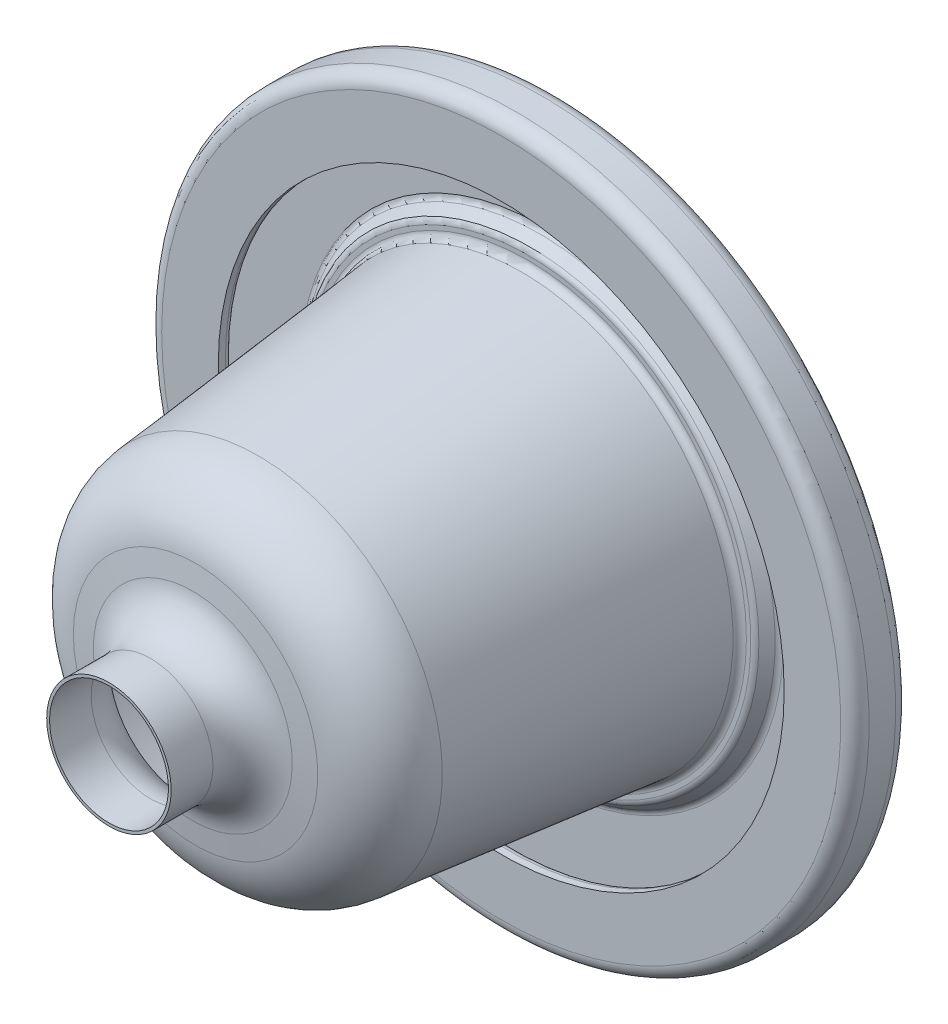
ISO-10303-21;
HEADER;
FILE_DESCRIPTION(('STEP AP214'),'2;1');
FILE_NAME('part.step','',(''),(''),'','','');
FILE_SCHEMA(('AUTOMOTIVE_DESIGN { 1 0 10303 214 1 1 1 1 }'));
ENDSEC;
DATA;
#1=APPLICATION_CONTEXT('core data for automotive mechanical design processes');
#2=APPLICATION_PROTOCOL_DEFINITION('international standard','automotive_design',2000,#1);
#3=PRODUCT_CONTEXT('',#1,'mechanical');
#4=PRODUCT('Part','Part','',(#3));
#5=PRODUCT_RELATED_PRODUCT_CATEGORY('part','',(#4));
#6=PRODUCT_DEFINITION_FORMATION('','',#4);
#7=PRODUCT_DEFINITION_CONTEXT('part definition',#1,'design');
#8=PRODUCT_DEFINITION('design','',#6,#7);
#9=PRODUCT_DEFINITION_SHAPE('','',#8);
#10=(LENGTH_UNIT() NAMED_UNIT(*) SI_UNIT(.MILLI.,.METRE.));
#11=(NAMED_UNIT(*) PLANE_ANGLE_UNIT() SI_UNIT($,.RADIAN.));
#12=(NAMED_UNIT(*) SI_UNIT($,.STERADIAN.) SOLID_ANGLE_UNIT());
#13=UNCERTAINTY_MEASURE_WITH_UNIT(LENGTH_MEASURE(1.E-05),#10,'distance_accuracy_value','');
#14=(GEOMETRIC_REPRESENTATION_CONTEXT(3) GLOBAL_UNCERTAINTY_ASSIGNED_CONTEXT((#13)) GLOBAL_UNIT_ASSIGNED_CONTEXT((#10,
#11,#12)) REPRESENTATION_CONTEXT('',''));
#15=CARTESIAN_POINT('',(0.,0.,0.));
#16=DIRECTION('',(0.,0.,1.));
#17=DIRECTION('',(1.,0.,0.));
#18=AXIS2_PLACEMENT_3D('',#15,#16,#17);
#19=CARTESIAN_POINT('',(0.,0.,-2.60568683672719));
#20=DIRECTION('',(0.,0.,1.));
#21=DIRECTION('',(1.,0.,0.));
#22=AXIS2_PLACEMENT_3D('',#19,#20,#21);
#23=PLANE('',#22);
#24=CARTESIAN_POINT('',(0.,0.,-2.60568683672719));
#25=DIRECTION('',(0.,0.,-1.));
#26=DIRECTION('',(-1.,0.,0.));
#27=AXIS2_PLACEMENT_3D('',#24,#25,#26);
#28=CIRCLE('',#27,15.8);
#29=CARTESIAN_POINT('',(-15.8,0.,-2.60568683672719));
#30=VERTEX_POINT('',#29);
#31=EDGE_CURVE('E253',#30,#30,#28,.T.);
#32=ORIENTED_EDGE('',*,*,#31,.T.);
#33=EDGE_LOOP('',(#32));
#34=FACE_BOUND('',#33,.T.);
#35=ADVANCED_FACE('F39',(#34),#23,.F.);
#36=CARTESIAN_POINT('',(0.2,0.,-2.40568683672719));
#37=DIRECTION('',(0.,0.,-1.));
#38=DIRECTION('',(-1.,0.,0.));
#39=AXIS2_PLACEMENT_3D('',#36,#37,#38);
#40=PLANE('',#39);
#41=CARTESIAN_POINT('',(0.,0.,-2.40568683672719));
#42=DIRECTION('',(0.,0.,-1.));
#43=DIRECTION('',(-1.,0.,0.));
#44=AXIS2_PLACEMENT_3D('',#41,#42,#43);
#45=CIRCLE('',#44,15.6);
#46=CARTESIAN_POINT('',(-15.6,0.,-2.40568683672719));
#47=VERTEX_POINT('',#46);
#48=EDGE_CURVE('E10',#47,#47,#45,.T.);
#49=ORIENTED_EDGE('',*,*,#48,.F.);
#50=EDGE_LOOP('',(#49));
#51=FACE_BOUND('',#50,.T.);
#52=ADVANCED_FACE('F560',(#51),#40,.F.);
#53=CARTESIAN_POINT('',(0.,0.,-2.20568683672719));
#54=DIRECTION('',(0.,0.,-1.));
#55=DIRECTION('',(-1.,0.,0.));
#56=AXIS2_PLACEMENT_3D('',#53,#54,#55);
#57=TOROIDAL_SURFACE('',#56,15.6,0.2);
#58=CARTESIAN_POINT('',(0.,0.,-2.20568683672719));
#59=DIRECTION('',(0.,0.,-1.));
#60=DIRECTION('',(-1.,0.,0.));
#61=AXIS2_PLACEMENT_3D('',#58,#59,#60);
#62=CIRCLE('',#61,15.8);
#63=CARTESIAN_POINT('',(-15.8,0.,-2.20568683672719));
#64=VERTEX_POINT('',#63);
#65=EDGE_CURVE('E46',#64,#64,#62,.T.);
#66=ORIENTED_EDGE('',*,*,#65,.F.);
#67=EDGE_LOOP('',(#66));
#68=FACE_BOUND('',#67,.T.);
#69=ORIENTED_EDGE('',*,*,#48,.T.);
#70=EDGE_LOOP('',(#69));
#71=FACE_BOUND('',#70,.T.);
#72=ADVANCED_FACE('F555',(#68,#71),#57,.F.);
#73=CARTESIAN_POINT('',(0.,0.,0.));
#74=DIRECTION('',(0.,0.,-1.));
#75=DIRECTION('',(-1.,0.,0.));
#76=AXIS2_PLACEMENT_3D('',#73,#74,#75);
#77=CYLINDRICAL_SURFACE('',#76,15.8);
#78=CARTESIAN_POINT('',(0.,0.,-1.60568683672719));
#79=DIRECTION('',(0.,0.,-1.));
#80=DIRECTION('',(-1.,0.,0.));
#81=AXIS2_PLACEMENT_3D('',#78,#79,#80);
#82=CIRCLE('',#81,15.8);
#83=CARTESIAN_POINT('',(-15.8,0.,-1.60568683672719));
#84=VERTEX_POINT('',#83);
#85=EDGE_CURVE('E53',#84,#84,#82,.T.);
#86=ORIENTED_EDGE('',*,*,#85,.F.);
#87=EDGE_LOOP('',(#86));
#88=FACE_BOUND('',#87,.T.);
#89=ORIENTED_EDGE('',*,*,#65,.T.);
#90=EDGE_LOOP('',(#89));
#91=FACE_BOUND('',#90,.T.);
#92=ADVANCED_FACE('F550',(#88,#91),#77,.F.);
#93=CARTESIAN_POINT('',(0.,0.,-1.60568683672719));
#94=DIRECTION('',(0.,0.,-1.));
#95=DIRECTION('',(-1.,0.,0.));
#96=AXIS2_PLACEMENT_3D('',#93,#94,#95);
#97=TOROIDAL_SURFACE('',#96,16.,0.199999999999999);
#98=CARTESIAN_POINT('',(0.,0.,-1.40568683672719));
#99=DIRECTION('',(0.,0.,-1.));
#100=DIRECTION('',(-1.,0.,0.));
#101=AXIS2_PLACEMENT_3D('',#98,#99,#100);
#102=CIRCLE('',#101,16.);
#103=CARTESIAN_POINT('',(-16.,0.,-1.40568683672719));
#104=VERTEX_POINT('',#103);
#105=EDGE_CURVE('E59',#104,#104,#102,.T.);
#106=ORIENTED_EDGE('',*,*,#105,.F.);
#107=EDGE_LOOP('',(#106));
#108=FACE_BOUND('',#107,.T.);
#109=ORIENTED_EDGE('',*,*,#85,.T.);
#110=EDGE_LOOP('',(#109));
#111=FACE_BOUND('',#110,.T.);
#112=ADVANCED_FACE('F544',(#108,#111),#97,.T.);
#113=CARTESIAN_POINT('',(16.,0.,-1.40568683672719));
#114=DIRECTION('',(0.,0.,-1.));
#115=DIRECTION('',(-1.,0.,0.));
#116=AXIS2_PLACEMENT_3D('',#113,#114,#115);
#117=PLANE('',#116);
#118=CARTESIAN_POINT('',(0.,0.,-1.40568683672719));
#119=DIRECTION('',(0.,0.,-1.));
#120=DIRECTION('',(-1.,0.,0.));
#121=AXIS2_PLACEMENT_3D('',#118,#119,#120);
#122=CIRCLE('',#121,23.8);
#123=CARTESIAN_POINT('',(-23.8,0.,-1.40568683672719));
#124=VERTEX_POINT('',#123);
#125=EDGE_CURVE('E65',#124,#124,#122,.T.);
#126=ORIENTED_EDGE('',*,*,#125,.F.);
#127=EDGE_LOOP('',(#126));
#128=FACE_BOUND('',#127,.T.);
#129=ORIENTED_EDGE('',*,*,#105,.T.);
#130=EDGE_LOOP('',(#129));
#131=FACE_BOUND('',#130,.T.);
#132=ADVANCED_FACE('F538',(#128,#131),#117,.F.);
#133=CARTESIAN_POINT('',(0.,0.,-0.405686836727189));
#134=DIRECTION('',(0.,0.,-1.));
#135=DIRECTION('',(-1.,0.,0.));
#136=AXIS2_PLACEMENT_3D('',#133,#134,#135);
#137=TOROIDAL_SURFACE('',#136,23.8,1.);
#138=CARTESIAN_POINT('',(0.,0.,-0.405686836727182));
#139=DIRECTION('',(0.,0.,-1.));
#140=DIRECTION('',(-1.,0.,0.));
#141=AXIS2_PLACEMENT_3D('',#138,#139,#140);
#142=CIRCLE('',#141,24.8);
#143=CARTESIAN_POINT('',(-24.8,0.,-0.405686836727182));
#144=VERTEX_POINT('',#143);
#145=EDGE_CURVE('E69',#144,#144,#142,.T.);
#146=ORIENTED_EDGE('',*,*,#145,.F.);
#147=EDGE_LOOP('',(#146));
#148=FACE_BOUND('',#147,.T.);
#149=ORIENTED_EDGE('',*,*,#125,.T.);
#150=EDGE_LOOP('',(#149));
#151=FACE_BOUND('',#150,.T.);
#152=ADVANCED_FACE('F532',(#148,#151),#137,.F.);
#153=CARTESIAN_POINT('',(0.,0.,0.));
#154=DIRECTION('',(0.,0.,-1.));
#155=DIRECTION('',(-1.,0.,0.));
#156=AXIS2_PLACEMENT_3D('',#153,#154,#155);
#157=CYLINDRICAL_SURFACE('',#156,24.8);
#158=CARTESIAN_POINT('',(0.,0.,1.07323664059718));
#159=DIRECTION('',(0.,0.,-1.));
#160=DIRECTION('',(-1.,0.,0.));
#161=AXIS2_PLACEMENT_3D('',#158,#159,#160);
#162=CIRCLE('',#161,24.8);
#163=CARTESIAN_POINT('',(-24.8,0.,1.07323664059718));
#164=VERTEX_POINT('',#163);
#165=EDGE_CURVE('E73',#164,#164,#162,.T.);
#166=ORIENTED_EDGE('',*,*,#165,.F.);
#167=EDGE_LOOP('',(#166));
#168=FACE_BOUND('',#167,.T.);
#169=ORIENTED_EDGE('',*,*,#145,.T.);
#170=EDGE_LOOP('',(#169));
#171=FACE_BOUND('',#170,.T.);
#172=ADVANCED_FACE('F526',(#168,#171),#157,.F.);
#173=CARTESIAN_POINT('',(0.,0.,1.07323664059719));
#174=DIRECTION('',(0.,0.,-1.));
#175=DIRECTION('',(-1.,0.,0.));
#176=AXIS2_PLACEMENT_3D('',#173,#174,#175);
#177=TOROIDAL_SURFACE('',#176,23.8,1.);
#178=CARTESIAN_POINT('',(0.,0.,2.07323664059719));
#179=DIRECTION('',(0.,0.,-1.));
#180=DIRECTION('',(-1.,0.,0.));
#181=AXIS2_PLACEMENT_3D('',#178,#179,#180);
#182=CIRCLE('',#181,23.8);
#183=CARTESIAN_POINT('',(-23.8,0.,2.07323664059719));
#184=VERTEX_POINT('',#183);
#185=EDGE_CURVE('E77',#184,#184,#182,.T.);
#186=ORIENTED_EDGE('',*,*,#185,.F.);
#187=EDGE_LOOP('',(#186));
#188=FACE_BOUND('',#187,.T.);
#189=ORIENTED_EDGE('',*,*,#165,.T.);
#190=EDGE_LOOP('',(#189));
#191=FACE_BOUND('',#190,.T.);
#192=ADVANCED_FACE('F520',(#188,#191),#177,.F.);
#193=CARTESIAN_POINT('',(23.8,0.,2.07323664059719));
#194=DIRECTION('',(0.,0.,1.));
#195=DIRECTION('',(1.,0.,0.));
#196=AXIS2_PLACEMENT_3D('',#193,#194,#195);
#197=PLANE('',#196);
#198=CARTESIAN_POINT('',(0.,0.,2.07323664059719));
#199=DIRECTION('',(0.,0.,-1.));
#200=DIRECTION('',(-1.,0.,0.));
#201=AXIS2_PLACEMENT_3D('',#198,#199,#200);
#202=CIRCLE('',#201,20.2);
#203=CARTESIAN_POINT('',(-20.2,0.,2.07323664059719));
#204=VERTEX_POINT('',#203);
#205=EDGE_CURVE('E81',#204,#204,#202,.T.);
#206=ORIENTED_EDGE('',*,*,#205,.F.);
#207=EDGE_LOOP('',(#206));
#208=FACE_BOUND('',#207,.T.);
#209=ORIENTED_EDGE('',*,*,#185,.T.);
#210=EDGE_LOOP('',(#209));
#211=FACE_BOUND('',#210,.T.);
#212=ADVANCED_FACE('F514',(#208,#211),#197,.F.);
#213=CARTESIAN_POINT('',(0.,0.,0.));
#214=DIRECTION('',(0.,0.,-1.));
#215=DIRECTION('',(-1.,0.,0.));
#216=AXIS2_PLACEMENT_3D('',#213,#214,#215);
#217=CYLINDRICAL_SURFACE('',#216,20.2);
#218=CARTESIAN_POINT('',(0.,0.,1.9732366405972));
#219=DIRECTION('',(0.,0.,-1.));
#220=DIRECTION('',(-1.,0.,0.));
#221=AXIS2_PLACEMENT_3D('',#218,#219,#220);
#222=CIRCLE('',#221,20.2);
#223=CARTESIAN_POINT('',(-20.2,0.,1.9732366405972));
#224=VERTEX_POINT('',#223);
#225=EDGE_CURVE('E85',#224,#224,#222,.T.);
#226=ORIENTED_EDGE('',*,*,#225,.F.);
#227=EDGE_LOOP('',(#226));
#228=FACE_BOUND('',#227,.T.);
#229=ORIENTED_EDGE('',*,*,#205,.T.);
#230=EDGE_LOOP('',(#229));
#231=FACE_BOUND('',#230,.T.);
#232=ADVANCED_FACE('F508',(#228,#231),#217,.T.);
#233=CARTESIAN_POINT('',(0.,0.,1.97323664059719));
#234=DIRECTION('',(0.,0.,-1.));
#235=DIRECTION('',(-1.,0.,0.));
#236=AXIS2_PLACEMENT_3D('',#233,#234,#235);
#237=TOROIDAL_SURFACE('',#236,20.7,0.5);
#238=CARTESIAN_POINT('',(0.,0.,1.47323664059719));
#239=DIRECTION('',(0.,0.,-1.));
#240=DIRECTION('',(-1.,0.,0.));
#241=AXIS2_PLACEMENT_3D('',#238,#239,#240);
#242=CIRCLE('',#241,20.7);
#243=CARTESIAN_POINT('',(-20.7,0.,1.47323664059719));
#244=VERTEX_POINT('',#243);
#245=EDGE_CURVE('E89',#244,#244,#242,.T.);
#246=ORIENTED_EDGE('',*,*,#245,.F.);
#247=EDGE_LOOP('',(#246));
#248=FACE_BOUND('',#247,.T.);
#249=ORIENTED_EDGE('',*,*,#225,.T.);
#250=EDGE_LOOP('',(#249));
#251=FACE_BOUND('',#250,.T.);
#252=ADVANCED_FACE('F502',(#248,#251),#237,.F.);
#253=CARTESIAN_POINT('',(20.7,0.,1.47323664059719));
#254=DIRECTION('',(0.,0.,-1.));
#255=DIRECTION('',(-1.,0.,0.));
#256=AXIS2_PLACEMENT_3D('',#253,#254,#255);
#257=PLANE('',#256);
#258=CARTESIAN_POINT('',(0.,0.,1.47323664059719));
#259=DIRECTION('',(0.,0.,-1.));
#260=DIRECTION('',(-1.,0.,0.));
#261=AXIS2_PLACEMENT_3D('',#258,#259,#260);
#262=CIRCLE('',#261,23.7);
#263=CARTESIAN_POINT('',(-23.7,0.,1.47323664059719));
#264=VERTEX_POINT('',#263);
#265=EDGE_CURVE('E93',#264,#264,#262,.T.);
#266=ORIENTED_EDGE('',*,*,#265,.F.);
#267=EDGE_LOOP('',(#266));
#268=FACE_BOUND('',#267,.T.);
#269=ORIENTED_EDGE('',*,*,#245,.T.);
#270=EDGE_LOOP('',(#269));
#271=FACE_BOUND('',#270,.T.);
#272=ADVANCED_FACE('F496',(#268,#271),#257,.F.);
#273=CARTESIAN_POINT('',(0.,0.,0.973236640597192));
#274=DIRECTION('',(0.,0.,-1.));
#275=DIRECTION('',(-1.,0.,0.));
#276=AXIS2_PLACEMENT_3D('',#273,#274,#275);
#277=TOROIDAL_SURFACE('',#276,23.7,0.5);
#278=CARTESIAN_POINT('',(0.,0.,0.973236640597188));
#279=DIRECTION('',(0.,0.,-1.));
#280=DIRECTION('',(-1.,0.,0.));
#281=AXIS2_PLACEMENT_3D('',#278,#279,#280);
#282=CIRCLE('',#281,24.2);
#283=CARTESIAN_POINT('',(-24.2,0.,0.973236640597188));
#284=VERTEX_POINT('',#283);
#285=EDGE_CURVE('E97',#284,#284,#282,.T.);
#286=ORIENTED_EDGE('',*,*,#285,.F.);
#287=EDGE_LOOP('',(#286));
#288=FACE_BOUND('',#287,.T.);
#289=ORIENTED_EDGE('',*,*,#265,.T.);
#290=EDGE_LOOP('',(#289));
#291=FACE_BOUND('',#290,.T.);
#292=ADVANCED_FACE('F490',(#288,#291),#277,.T.);
#293=CARTESIAN_POINT('',(0.,0.,0.));
#294=DIRECTION('',(0.,0.,-1.));
#295=DIRECTION('',(-1.,0.,0.));
#296=AXIS2_PLACEMENT_3D('',#293,#294,#295);
#297=CYLINDRICAL_SURFACE('',#296,24.2);
#298=CARTESIAN_POINT('',(0.,0.,0.194313163272817));
#299=DIRECTION('',(0.,0.,-1.));
#300=DIRECTION('',(-1.,0.,0.));
#301=AXIS2_PLACEMENT_3D('',#298,#299,#300);
#302=CIRCLE('',#301,24.2);
#303=CARTESIAN_POINT('',(-24.2,0.,0.194313163272817));
#304=VERTEX_POINT('',#303);
#305=EDGE_CURVE('E101',#304,#304,#302,.T.);
#306=ORIENTED_EDGE('',*,*,#305,.F.);
#307=EDGE_LOOP('',(#306));
#308=FACE_BOUND('',#307,.T.);
#309=ORIENTED_EDGE('',*,*,#285,.T.);
#310=EDGE_LOOP('',(#309));
#311=FACE_BOUND('',#310,.T.);
#312=ADVANCED_FACE('F484',(#308,#311),#297,.T.);
#313=CARTESIAN_POINT('',(0.,0.,0.19431316327281));
#314=DIRECTION('',(0.,0.,-1.));
#315=DIRECTION('',(-1.,0.,0.));
#316=AXIS2_PLACEMENT_3D('',#313,#314,#315);
#317=TOROIDAL_SURFACE('',#316,23.2,1.);
#318=CARTESIAN_POINT('',(0.,0.,-0.805686836727191));
#319=DIRECTION('',(0.,0.,-1.));
#320=DIRECTION('',(-1.,0.,0.));
#321=AXIS2_PLACEMENT_3D('',#318,#319,#320);
#322=CIRCLE('',#321,23.2);
#323=CARTESIAN_POINT('',(-23.2,0.,-0.805686836727191));
#324=VERTEX_POINT('',#323);
#325=EDGE_CURVE('E105',#324,#324,#322,.T.);
#326=ORIENTED_EDGE('',*,*,#325,.F.);
#327=EDGE_LOOP('',(#326));
#328=FACE_BOUND('',#327,.T.);
#329=ORIENTED_EDGE('',*,*,#305,.T.);
#330=EDGE_LOOP('',(#329));
#331=FACE_BOUND('',#330,.T.);
#332=ADVANCED_FACE('F478',(#328,#331),#317,.T.);
#333=CARTESIAN_POINT('',(23.2,0.,-0.80568683672719));
#334=DIRECTION('',(0.,0.,1.));
#335=DIRECTION('',(1.,0.,0.));
#336=AXIS2_PLACEMENT_3D('',#333,#334,#335);
#337=PLANE('',#336);
#338=CARTESIAN_POINT('',(0.,0.,-0.80568683672719));
#339=DIRECTION('',(0.,0.,-1.));
#340=DIRECTION('',(-1.,0.,0.));
#341=AXIS2_PLACEMENT_3D('',#338,#339,#340);
#342=CIRCLE('',#341,16.9577694013761);
#343=CARTESIAN_POINT('',(-16.9577694013761,0.,-0.80568683672719));
#344=VERTEX_POINT('',#343);
#345=EDGE_CURVE('E109',#344,#344,#342,.T.);
#346=ORIENTED_EDGE('',*,*,#345,.F.);
#347=EDGE_LOOP('',(#346));
#348=FACE_BOUND('',#347,.T.);
#349=ORIENTED_EDGE('',*,*,#325,.T.);
#350=EDGE_LOOP('',(#349));
#351=FACE_BOUND('',#350,.T.);
#352=ADVANCED_FACE('F472',(#348,#351),#337,.F.);
#353=CARTESIAN_POINT('',(0.,0.,-0.30568683672719));
#354=DIRECTION('',(0.,0.,-1.));
#355=DIRECTION('',(-1.,0.,0.));
#356=AXIS2_PLACEMENT_3D('',#353,#354,#355);
#357=TOROIDAL_SURFACE('',#356,16.9577694013761,0.500000000000001);
#358=CARTESIAN_POINT('',(0.,0.,-0.621633158140157));
#359=DIRECTION('',(0.,0.,-1.));
#360=DIRECTION('',(-1.,0.,0.));
#361=AXIS2_PLACEMENT_3D('',#358,#359,#360);
#362=CIRCLE('',#361,16.5702414385326);
#363=CARTESIAN_POINT('',(-16.5702414385326,0.,-0.621633158140157));
#364=VERTEX_POINT('',#363);
#365=EDGE_CURVE('E113',#364,#364,#362,.T.);
#366=ORIENTED_EDGE('',*,*,#365,.F.);
#367=EDGE_LOOP('',(#366));
#368=FACE_BOUND('',#367,.T.);
#369=ORIENTED_EDGE('',*,*,#345,.T.);
#370=EDGE_LOOP('',(#369));
#371=FACE_BOUND('',#370,.T.);
#372=ADVANCED_FACE('F466',(#368,#371),#357,.T.);
#373=CARTESIAN_POINT('',(0.,0.,-0.621633158140157));
#374=DIRECTION('',(0.,0.,-1.));
#375=DIRECTION('',(-1.,0.,0.));
#376=AXIS2_PLACEMENT_3D('',#373,#374,#375);
#377=CONICAL_SURFACE('',#376,16.5702414385326,0.683992731553361);
#378=CARTESIAN_POINT('',(0.,0.,0.0102594846857788));
#379=DIRECTION('',(0.,0.,-1.));
#380=DIRECTION('',(-1.,0.,0.));
#381=AXIS2_PLACEMENT_3D('',#378,#379,#380);
#382=CIRCLE('',#381,16.0550678893417);
#383=CARTESIAN_POINT('',(-16.0550678893417,0.,0.0102594846857788));
#384=VERTEX_POINT('',#383);
#385=EDGE_CURVE('E117',#384,#384,#382,.T.);
#386=ORIENTED_EDGE('',*,*,#385,.F.);
#387=EDGE_LOOP('',(#386));
#388=FACE_BOUND('',#387,.T.);
#389=ORIENTED_EDGE('',*,*,#365,.T.);
#390=EDGE_LOOP('',(#389));
#391=FACE_BOUND('',#390,.T.);
#392=ADVANCED_FACE('F460',(#388,#391),#377,.F.);
#393=CARTESIAN_POINT('',(0.,0.,-0.305686836727189));
#394=DIRECTION('',(0.,0.,-1.));
#395=DIRECTION('',(-1.,0.,0.));
#396=AXIS2_PLACEMENT_3D('',#393,#394,#395);
#397=TOROIDAL_SURFACE('',#396,15.6675399264983,0.500000000000001);
#398=CARTESIAN_POINT('',(0.,0.,0.194313163272812));
#399=DIRECTION('',(0.,0.,-1.));
#400=DIRECTION('',(-1.,0.,0.));
#401=AXIS2_PLACEMENT_3D('',#398,#399,#400);
#402=CIRCLE('',#401,15.6675399264983);
#403=CARTESIAN_POINT('',(-15.6675399264983,0.,0.194313163272812));
#404=VERTEX_POINT('',#403);
#405=EDGE_CURVE('E121',#404,#404,#402,.T.);
#406=ORIENTED_EDGE('',*,*,#405,.F.);
#407=EDGE_LOOP('',(#406));
#408=FACE_BOUND('',#407,.T.);
#409=ORIENTED_EDGE('',*,*,#385,.T.);
#410=EDGE_LOOP('',(#409));
#411=FACE_BOUND('',#410,.T.);
#412=ADVANCED_FACE('F454',(#408,#411),#397,.F.);
#413=CARTESIAN_POINT('',(15.6675399264983,0.,0.194313163272812));
#414=DIRECTION('',(0.,0.,1.));
#415=DIRECTION('',(1.,0.,0.));
#416=AXIS2_PLACEMENT_3D('',#413,#414,#415);
#417=PLANE('',#416);
#418=CARTESIAN_POINT('',(0.,0.,0.194313163272811));
#419=DIRECTION('',(0.,0.,-1.));
#420=DIRECTION('',(-1.,0.,0.));
#421=AXIS2_PLACEMENT_3D('',#418,#419,#420);
#422=CIRCLE('',#421,15.2701467619401);
#423=CARTESIAN_POINT('',(-15.2701467619401,0.,0.194313163272811));
#424=VERTEX_POINT('',#423);
#425=EDGE_CURVE('E125',#424,#424,#422,.T.);
#426=ORIENTED_EDGE('',*,*,#425,.F.);
#427=EDGE_LOOP('',(#426));
#428=FACE_BOUND('',#427,.T.);
#429=ORIENTED_EDGE('',*,*,#405,.T.);
#430=EDGE_LOOP('',(#429));
#431=FACE_BOUND('',#430,.T.);
#432=ADVANCED_FACE('F448',(#428,#431),#417,.F.);
#433=CARTESIAN_POINT('',(0.,0.,0.694313163272811));
#434=DIRECTION('',(0.,0.,-1.));
#435=DIRECTION('',(-1.,0.,0.));
#436=AXIS2_PLACEMENT_3D('',#433,#434,#435);
#437=TOROIDAL_SURFACE('',#436,15.2701467619401,0.5);
#438=CARTESIAN_POINT('',(0.,0.,0.642095704262941));
#439=DIRECTION('',(0.,0.,-1.));
#440=DIRECTION('',(-1.,0.,0.));
#441=AXIS2_PLACEMENT_3D('',#438,#439,#440);
#442=CIRCLE('',#441,14.7728809004791);
#443=CARTESIAN_POINT('',(-14.7728809004791,0.,0.642095704262941));
#444=VERTEX_POINT('',#443);
#445=EDGE_CURVE('E129',#444,#444,#442,.T.);
#446=ORIENTED_EDGE('',*,*,#445,.F.);
#447=EDGE_LOOP('',(#446));
#448=FACE_BOUND('',#447,.T.);
#449=ORIENTED_EDGE('',*,*,#425,.T.);
#450=EDGE_LOOP('',(#449));
#451=FACE_BOUND('',#450,.T.);
#452=ADVANCED_FACE('F442',(#448,#451),#437,.T.);
#453=CARTESIAN_POINT('',(0.,0.,0.642095704262941));
#454=DIRECTION('',(0.,0.,-1.));
#455=DIRECTION('',(-1.,0.,0.));
#456=AXIS2_PLACEMENT_3D('',#453,#454,#455);
#457=CONICAL_SURFACE('',#456,14.7728809004791,0.104625695063181);
#458=CARTESIAN_POINT('',(0.,0.,19.4193878518742));
#459=DIRECTION('',(0.,0.,-1.));
#460=DIRECTION('',(-1.,0.,0.));
#461=AXIS2_PLACEMENT_3D('',#458,#459,#460);
#462=CIRCLE('',#461,12.8010936554156);
#463=CARTESIAN_POINT('',(-12.8010936554156,0.,19.4193878518742));
#464=VERTEX_POINT('',#463);
#465=EDGE_CURVE('E133',#464,#464,#462,.T.);
#466=ORIENTED_EDGE('',*,*,#465,.F.);
#467=EDGE_LOOP('',(#466));
#468=FACE_BOUND('',#467,.T.);
#469=ORIENTED_EDGE('',*,*,#445,.T.);
#470=EDGE_LOOP('',(#469));
#471=FACE_BOUND('',#470,.T.);
#472=ADVANCED_FACE('F436',(#468,#471),#457,.F.);
#473=CARTESIAN_POINT('',(0.,0.,18.9181002453794));
#474=DIRECTION('',(0.,0.,-1.));
#475=DIRECTION('',(-1.,0.,0.));
#476=AXIS2_PLACEMENT_3D('',#473,#474,#475);
#477=TOROIDAL_SURFACE('',#476,8.02734138538998,4.8);
#478=CARTESIAN_POINT('',(0.,0.,23.6820655450261));
#479=DIRECTION('',(0.,0.,-1.));
#480=DIRECTION('',(-1.,0.,0.));
#481=AXIS2_PLACEMENT_3D('',#478,#479,#480);
#482=CIRCLE('',#481,8.61439728031201);
#483=CARTESIAN_POINT('',(-8.61439728031201,0.,23.6820655450261));
#484=VERTEX_POINT('',#483);
#485=EDGE_CURVE('E137',#484,#484,#482,.T.);
#486=ORIENTED_EDGE('',*,*,#485,.F.);
#487=EDGE_LOOP('',(#486));
#488=FACE_BOUND('',#487,.T.);
#489=ORIENTED_EDGE('',*,*,#465,.T.);
#490=EDGE_LOOP('',(#489));
#491=FACE_BOUND('',#490,.T.);
#492=ADVANCED_FACE('F430',(#488,#491),#477,.F.);
#493=CARTESIAN_POINT('',(0.,0.,23.6820655450261));
#494=DIRECTION('',(0.,0.,-1.));
#495=DIRECTION('',(-1.,0.,0.));
#496=AXIS2_PLACEMENT_3D('',#493,#494,#495);
#497=CONICAL_SURFACE('',#496,8.61439728031201,1.44818604034337);
#498=CARTESIAN_POINT('',(0.,0.,23.8799417760087));
#499=DIRECTION('',(0.,0.,-1.));
#500=DIRECTION('',(-1.,0.,0.));
#501=AXIS2_PLACEMENT_3D('',#498,#499,#500);
#502=CIRCLE('',#501,7.00862940338532);
#503=CARTESIAN_POINT('',(-7.00862940338532,0.,23.8799417760087));
#504=VERTEX_POINT('',#503);
#505=EDGE_CURVE('E141',#504,#504,#502,.T.);
#506=ORIENTED_EDGE('',*,*,#505,.F.);
#507=EDGE_LOOP('',(#506));
#508=FACE_BOUND('',#507,.T.);
#509=ORIENTED_EDGE('',*,*,#485,.T.);
#510=EDGE_LOOP('',(#509));
#511=FACE_BOUND('',#510,.T.);
#512=ADVANCED_FACE('F424',(#508,#511),#497,.F.);
#513=CARTESIAN_POINT('',(0.,0.,27.0559186424398));
#514=DIRECTION('',(0.,0.,-1.));
#515=DIRECTION('',(-1.,0.,0.));
#516=AXIS2_PLACEMENT_3D('',#513,#514,#515);
#517=TOROIDAL_SURFACE('',#516,7.4,3.2);
#518=CARTESIAN_POINT('',(0.,0.,27.0559186424398));
#519=DIRECTION('',(0.,0.,-1.));
#520=DIRECTION('',(-1.,0.,0.));
#521=AXIS2_PLACEMENT_3D('',#518,#519,#520);
#522=CIRCLE('',#521,4.2);
#523=CARTESIAN_POINT('',(-4.2,0.,27.0559186424398));
#524=VERTEX_POINT('',#523);
#525=EDGE_CURVE('E145',#524,#524,#522,.T.);
#526=ORIENTED_EDGE('',*,*,#525,.F.);
#527=EDGE_LOOP('',(#526));
#528=FACE_BOUND('',#527,.T.);
#529=ORIENTED_EDGE('',*,*,#505,.T.);
#530=EDGE_LOOP('',(#529));
#531=FACE_BOUND('',#530,.T.);
#532=ADVANCED_FACE('F418',(#528,#531),#517,.T.);
#533=CARTESIAN_POINT('',(0.,0.,0.));
#534=DIRECTION('',(0.,0.,-1.));
#535=DIRECTION('',(-1.,0.,0.));
#536=AXIS2_PLACEMENT_3D('',#533,#534,#535);
#537=CYLINDRICAL_SURFACE('',#536,4.2);
#538=CARTESIAN_POINT('',(0.,0.,30.));
#539=DIRECTION('',(0.,0.,-1.));
#540=DIRECTION('',(-1.,0.,0.));
#541=AXIS2_PLACEMENT_3D('',#538,#539,#540);
#542=CIRCLE('',#541,4.2);
#543=CARTESIAN_POINT('',(-4.2,0.,30.));
#544=VERTEX_POINT('',#543);
#545=EDGE_CURVE('E149',#544,#544,#542,.T.);
#546=ORIENTED_EDGE('',*,*,#545,.F.);
#547=EDGE_LOOP('',(#546));
#548=FACE_BOUND('',#547,.T.);
#549=ORIENTED_EDGE('',*,*,#525,.T.);
#550=EDGE_LOOP('',(#549));
#551=FACE_BOUND('',#550,.T.);
#552=ADVANCED_FACE('F412',(#548,#551),#537,.F.);
#553=CARTESIAN_POINT('',(4.2,0.,30.));
#554=DIRECTION('',(0.,0.,-1.));
#555=DIRECTION('',(-1.,0.,0.));
#556=AXIS2_PLACEMENT_3D('',#553,#554,#555);
#557=PLANE('',#556);
#558=CARTESIAN_POINT('',(0.,0.,30.));
#559=DIRECTION('',(0.,0.,-1.));
#560=DIRECTION('',(-1.,0.,0.));
#561=AXIS2_PLACEMENT_3D('',#558,#559,#560);
#562=CIRCLE('',#561,4.4);
#563=CARTESIAN_POINT('',(-4.4,0.,30.));
#564=VERTEX_POINT('',#563);
#565=EDGE_CURVE('E153',#564,#564,#562,.T.);
#566=ORIENTED_EDGE('',*,*,#565,.F.);
#567=EDGE_LOOP('',(#566));
#568=FACE_BOUND('',#567,.T.);
#569=ORIENTED_EDGE('',*,*,#545,.T.);
#570=EDGE_LOOP('',(#569));
#571=FACE_BOUND('',#570,.T.);
#572=ADVANCED_FACE('F406',(#568,#571),#557,.F.);
#573=CARTESIAN_POINT('',(0.,0.,0.));
#574=DIRECTION('',(0.,0.,-1.));
#575=DIRECTION('',(-1.,0.,0.));
#576=AXIS2_PLACEMENT_3D('',#573,#574,#575);
#577=CYLINDRICAL_SURFACE('',#576,4.4);
#578=CARTESIAN_POINT('',(0.,0.,27.0559186424398));
#579=DIRECTION('',(0.,0.,-1.));
#580=DIRECTION('',(-1.,0.,0.));
#581=AXIS2_PLACEMENT_3D('',#578,#579,#580);
#582=CIRCLE('',#581,4.4);
#583=CARTESIAN_POINT('',(-4.4,0.,27.0559186424398));
#584=VERTEX_POINT('',#583);
#585=EDGE_CURVE('E157',#584,#584,#582,.T.);
#586=ORIENTED_EDGE('',*,*,#585,.F.);
#587=EDGE_LOOP('',(#586));
#588=FACE_BOUND('',#587,.T.);
#589=ORIENTED_EDGE('',*,*,#565,.T.);
#590=EDGE_LOOP('',(#589));
#591=FACE_BOUND('',#590,.T.);
#592=ADVANCED_FACE('F400',(#588,#591),#577,.T.);
#593=CARTESIAN_POINT('',(0.,0.,27.0559186424398));
#594=DIRECTION('',(0.,0.,-1.));
#595=DIRECTION('',(-1.,0.,0.));
#596=AXIS2_PLACEMENT_3D('',#593,#594,#595);
#597=TOROIDAL_SURFACE('',#596,7.4,3.);
#598=CARTESIAN_POINT('',(0.,0.,24.0784403301607));
#599=DIRECTION('',(0.,0.,-1.));
#600=DIRECTION('',(-1.,0.,0.));
#601=AXIS2_PLACEMENT_3D('',#598,#599,#600);
#602=CIRCLE('',#601,7.03309006567374);
#603=CARTESIAN_POINT('',(-7.03309006567374,0.,24.0784403301607));
#604=VERTEX_POINT('',#603);
#605=EDGE_CURVE('E161',#604,#604,#602,.T.);
#606=ORIENTED_EDGE('',*,*,#605,.F.);
#607=EDGE_LOOP('',(#606));
#608=FACE_BOUND('',#607,.T.);
#609=ORIENTED_EDGE('',*,*,#585,.T.);
#610=EDGE_LOOP('',(#609));
#611=FACE_BOUND('',#610,.T.);
#612=ADVANCED_FACE('F394',(#608,#611),#597,.F.);
#613=CARTESIAN_POINT('',(0.,0.,24.0784403301607));
#614=DIRECTION('',(0.,0.,-1.));
#615=DIRECTION('',(-1.,0.,0.));
#616=AXIS2_PLACEMENT_3D('',#613,#614,#615);
#617=CONICAL_SURFACE('',#616,7.03309006567374,1.44818604034337);
#618=CARTESIAN_POINT('',(0.,0.,23.880564099178));
#619=DIRECTION('',(0.,0.,-1.));
#620=DIRECTION('',(-1.,0.,0.));
#621=AXIS2_PLACEMENT_3D('',#618,#619,#620);
#622=CIRCLE('',#621,8.63885794260043);
#623=CARTESIAN_POINT('',(-8.63885794260043,0.,23.880564099178));
#624=VERTEX_POINT('',#623);
#625=EDGE_CURVE('E165',#624,#624,#622,.T.);
#626=ORIENTED_EDGE('',*,*,#625,.F.);
#627=EDGE_LOOP('',(#626));
#628=FACE_BOUND('',#627,.T.);
#629=ORIENTED_EDGE('',*,*,#605,.T.);
#630=EDGE_LOOP('',(#629));
#631=FACE_BOUND('',#630,.T.);
#632=ADVANCED_FACE('F388',(#628,#631),#617,.T.);
#633=CARTESIAN_POINT('',(0.,0.,18.9181002453794));
#634=DIRECTION('',(0.,0.,-1.));
#635=DIRECTION('',(-1.,0.,0.));
#636=AXIS2_PLACEMENT_3D('',#633,#634,#635);
#637=TOROIDAL_SURFACE('',#636,8.02734138538998,5.);
#638=CARTESIAN_POINT('',(0.,0.,19.4402748354782));
#639=DIRECTION('',(0.,0.,-1.));
#640=DIRECTION('',(-1.,0.,0.));
#641=AXIS2_PLACEMENT_3D('',#638,#639,#640);
#642=CIRCLE('',#641,13.);
#643=CARTESIAN_POINT('',(-13.,0.,19.4402748354782));
#644=VERTEX_POINT('',#643);
#645=EDGE_CURVE('E169',#644,#644,#642,.T.);
#646=ORIENTED_EDGE('',*,*,#645,.F.);
#647=EDGE_LOOP('',(#646));
#648=FACE_BOUND('',#647,.T.);
#649=ORIENTED_EDGE('',*,*,#625,.T.);
#650=EDGE_LOOP('',(#649));
#651=FACE_BOUND('',#650,.T.);
#652=ADVANCED_FACE('F382',(#648,#651),#637,.T.);
#653=CARTESIAN_POINT('',(0.,0.,19.4402748354782));
#654=DIRECTION('',(0.,0.,-1.));
#655=DIRECTION('',(-1.,0.,0.));
#656=AXIS2_PLACEMENT_3D('',#653,#654,#655);
#657=CONICAL_SURFACE('',#656,13.,0.104625695063181);
#658=CARTESIAN_POINT('',(0.,0.,0.842095704262941));
#659=DIRECTION('',(0.,0.,-1.));
#660=DIRECTION('',(-1.,0.,0.));
#661=AXIS2_PLACEMENT_3D('',#658,#659,#660);
#662=CIRCLE('',#661,14.9529787417725);
#663=CARTESIAN_POINT('',(-14.9529787417725,0.,0.842095704262941));
#664=VERTEX_POINT('',#663);
#665=EDGE_CURVE('E173',#664,#664,#662,.T.);
#666=ORIENTED_EDGE('',*,*,#665,.F.);
#667=EDGE_LOOP('',(#666));
#668=FACE_BOUND('',#667,.T.);
#669=ORIENTED_EDGE('',*,*,#645,.T.);
#670=EDGE_LOOP('',(#669));
#671=FACE_BOUND('',#670,.T.);
#672=ADVANCED_FACE('F376',(#668,#671),#657,.T.);
#673=CARTESIAN_POINT('',(0.,0.,0.894313163272811));
#674=DIRECTION('',(0.,0.,-1.));
#675=DIRECTION('',(-1.,0.,0.));
#676=AXIS2_PLACEMENT_3D('',#673,#674,#675);
#677=TOROIDAL_SURFACE('',#676,15.4502446032335,0.5);
#678=CARTESIAN_POINT('',(0.,0.,0.394313163272811));
#679=DIRECTION('',(0.,0.,-1.));
#680=DIRECTION('',(-1.,0.,0.));
#681=AXIS2_PLACEMENT_3D('',#678,#679,#680);
#682=CIRCLE('',#681,15.4502446032335);
#683=CARTESIAN_POINT('',(-15.4502446032335,0.,0.394313163272811));
#684=VERTEX_POINT('',#683);
#685=EDGE_CURVE('E177',#684,#684,#682,.T.);
#686=ORIENTED_EDGE('',*,*,#685,.F.);
#687=EDGE_LOOP('',(#686));
#688=FACE_BOUND('',#687,.T.);
#689=ORIENTED_EDGE('',*,*,#665,.T.);
#690=EDGE_LOOP('',(#689));
#691=FACE_BOUND('',#690,.T.);
#692=ADVANCED_FACE('F370',(#688,#691),#677,.F.);
#693=CARTESIAN_POINT('',(15.7625285189273,0.,0.394313163272811));
#694=DIRECTION('',(0.,0.,-1.));
#695=DIRECTION('',(-1.,0.,0.));
#696=AXIS2_PLACEMENT_3D('',#693,#694,#695);
#697=PLANE('',#696);
#698=CARTESIAN_POINT('',(0.,0.,0.394313163272811));
#699=DIRECTION('',(0.,0.,-1.));
#700=DIRECTION('',(-1.,0.,0.));
#701=AXIS2_PLACEMENT_3D('',#698,#699,#700);
#702=CIRCLE('',#701,15.7625285189273);
#703=CARTESIAN_POINT('',(-15.7625285189273,0.,0.394313163272811));
#704=VERTEX_POINT('',#703);
#705=EDGE_CURVE('E181',#704,#704,#702,.T.);
#706=ORIENTED_EDGE('',*,*,#705,.F.);
#707=EDGE_LOOP('',(#706));
#708=FACE_BOUND('',#707,.T.);
#709=ORIENTED_EDGE('',*,*,#685,.T.);
#710=EDGE_LOOP('',(#709));
#711=FACE_BOUND('',#710,.T.);
#712=ADVANCED_FACE('F364',(#708,#711),#697,.F.);
#713=CARTESIAN_POINT('',(0.,0.,-0.105686836727189));
#714=DIRECTION('',(0.,0.,-1.));
#715=DIRECTION('',(-1.,0.,0.));
#716=AXIS2_PLACEMENT_3D('',#713,#714,#715);
#717=TOROIDAL_SURFACE('',#716,15.7625285189273,0.499999999999999);
#718=CARTESIAN_POINT('',(0.,0.,0.210259484685779));
#719=DIRECTION('',(0.,0.,-1.));
#720=DIRECTION('',(-1.,0.,0.));
#721=AXIS2_PLACEMENT_3D('',#718,#719,#720);
#722=CIRCLE('',#721,16.1500564817708);
#723=CARTESIAN_POINT('',(-16.1500564817708,0.,0.210259484685779));
#724=VERTEX_POINT('',#723);
#725=EDGE_CURVE('E185',#724,#724,#722,.T.);
#726=ORIENTED_EDGE('',*,*,#725,.F.);
#727=EDGE_LOOP('',(#726));
#728=FACE_BOUND('',#727,.T.);
#729=ORIENTED_EDGE('',*,*,#705,.T.);
#730=EDGE_LOOP('',(#729));
#731=FACE_BOUND('',#730,.T.);
#732=ADVANCED_FACE('F358',(#728,#731),#717,.T.);
#733=CARTESIAN_POINT('',(0.,0.,0.210259484685779));
#734=DIRECTION('',(0.,0.,-1.));
#735=DIRECTION('',(-1.,0.,0.));
#736=AXIS2_PLACEMENT_3D('',#733,#734,#735);
#737=CONICAL_SURFACE('',#736,16.1500564817708,0.68399273155336);
#738=CARTESIAN_POINT('',(0.,0.,-0.421633158140157));
#739=DIRECTION('',(0.,0.,-1.));
#740=DIRECTION('',(-1.,0.,0.));
#741=AXIS2_PLACEMENT_3D('',#738,#739,#740);
#742=CIRCLE('',#741,16.6652300309617);
#743=CARTESIAN_POINT('',(-16.6652300309617,0.,-0.421633158140157));
#744=VERTEX_POINT('',#743);
#745=EDGE_CURVE('E189',#744,#744,#742,.T.);
#746=ORIENTED_EDGE('',*,*,#745,.F.);
#747=EDGE_LOOP('',(#746));
#748=FACE_BOUND('',#747,.T.);
#749=ORIENTED_EDGE('',*,*,#725,.T.);
#750=EDGE_LOOP('',(#749));
#751=FACE_BOUND('',#750,.T.);
#752=ADVANCED_FACE('F352',(#748,#751),#737,.T.);
#753=CARTESIAN_POINT('',(0.,0.,-0.105686836727189));
#754=DIRECTION('',(0.,0.,-1.));
#755=DIRECTION('',(-1.,0.,0.));
#756=AXIS2_PLACEMENT_3D('',#753,#754,#755);
#757=TOROIDAL_SURFACE('',#756,17.0527579938051,0.500000000000001);
#758=CARTESIAN_POINT('',(0.,0.,-0.60568683672719));
#759=DIRECTION('',(0.,0.,-1.));
#760=DIRECTION('',(-1.,0.,0.));
#761=AXIS2_PLACEMENT_3D('',#758,#759,#760);
#762=CIRCLE('',#761,17.0527579938051);
#763=CARTESIAN_POINT('',(-17.0527579938051,0.,-0.60568683672719));
#764=VERTEX_POINT('',#763);
#765=EDGE_CURVE('E193',#764,#764,#762,.T.);
#766=ORIENTED_EDGE('',*,*,#765,.F.);
#767=EDGE_LOOP('',(#766));
#768=FACE_BOUND('',#767,.T.);
#769=ORIENTED_EDGE('',*,*,#745,.T.);
#770=EDGE_LOOP('',(#769));
#771=FACE_BOUND('',#770,.T.);
#772=ADVANCED_FACE('F346',(#768,#771),#757,.F.);
#773=CARTESIAN_POINT('',(23.,0.,-0.60568683672719));
#774=DIRECTION('',(0.,0.,-1.));
#775=DIRECTION('',(-1.,0.,0.));
#776=AXIS2_PLACEMENT_3D('',#773,#774,#775);
#777=PLANE('',#776);
#778=CARTESIAN_POINT('',(0.,0.,-0.60568683672719));
#779=DIRECTION('',(0.,0.,-1.));
#780=DIRECTION('',(-1.,0.,0.));
#781=AXIS2_PLACEMENT_3D('',#778,#779,#780);
#782=CIRCLE('',#781,23.);
#783=CARTESIAN_POINT('',(-23.,0.,-0.60568683672719));
#784=VERTEX_POINT('',#783);
#785=EDGE_CURVE('E197',#784,#784,#782,.T.);
#786=ORIENTED_EDGE('',*,*,#785,.F.);
#787=EDGE_LOOP('',(#786));
#788=FACE_BOUND('',#787,.T.);
#789=ORIENTED_EDGE('',*,*,#765,.T.);
#790=EDGE_LOOP('',(#789));
#791=FACE_BOUND('',#790,.T.);
#792=ADVANCED_FACE('F340',(#788,#791),#777,.F.);
#793=CARTESIAN_POINT('',(0.,0.,0.39431316327281));
#794=DIRECTION('',(0.,0.,-1.));
#795=DIRECTION('',(-1.,0.,0.));
#796=AXIS2_PLACEMENT_3D('',#793,#794,#795);
#797=TOROIDAL_SURFACE('',#796,23.,1.);
#798=CARTESIAN_POINT('',(0.,0.,0.394313163272817));
#799=DIRECTION('',(0.,0.,-1.));
#800=DIRECTION('',(-1.,0.,0.));
#801=AXIS2_PLACEMENT_3D('',#798,#799,#800);
#802=CIRCLE('',#801,24.);
#803=CARTESIAN_POINT('',(-24.,0.,0.394313163272817));
#804=VERTEX_POINT('',#803);
#805=EDGE_CURVE('E201',#804,#804,#802,.T.);
#806=ORIENTED_EDGE('',*,*,#805,.F.);
#807=EDGE_LOOP('',(#806));
#808=FACE_BOUND('',#807,.T.);
#809=ORIENTED_EDGE('',*,*,#785,.T.);
#810=EDGE_LOOP('',(#809));
#811=FACE_BOUND('',#810,.T.);
#812=ADVANCED_FACE('F334',(#808,#811),#797,.F.);
#813=CARTESIAN_POINT('',(0.,0.,0.));
#814=DIRECTION('',(0.,0.,-1.));
#815=DIRECTION('',(-1.,0.,0.));
#816=AXIS2_PLACEMENT_3D('',#813,#814,#815);
#817=CYLINDRICAL_SURFACE('',#816,24.);
#818=CARTESIAN_POINT('',(0.,0.,0.773236640597188));
#819=DIRECTION('',(0.,0.,-1.));
#820=DIRECTION('',(-1.,0.,0.));
#821=AXIS2_PLACEMENT_3D('',#818,#819,#820);
#822=CIRCLE('',#821,24.);
#823=CARTESIAN_POINT('',(-24.,0.,0.773236640597188));
#824=VERTEX_POINT('',#823);
#825=EDGE_CURVE('E205',#824,#824,#822,.T.);
#826=ORIENTED_EDGE('',*,*,#825,.F.);
#827=EDGE_LOOP('',(#826));
#828=FACE_BOUND('',#827,.T.);
#829=ORIENTED_EDGE('',*,*,#805,.T.);
#830=EDGE_LOOP('',(#829));
#831=FACE_BOUND('',#830,.T.);
#832=ADVANCED_FACE('F328',(#828,#831),#817,.F.);
#833=CARTESIAN_POINT('',(0.,0.,0.773236640597192));
#834=DIRECTION('',(0.,0.,-1.));
#835=DIRECTION('',(-1.,0.,0.));
#836=AXIS2_PLACEMENT_3D('',#833,#834,#835);
#837=TOROIDAL_SURFACE('',#836,23.5,0.5);
#838=CARTESIAN_POINT('',(0.,0.,1.27323664059719));
#839=DIRECTION('',(0.,0.,-1.));
#840=DIRECTION('',(-1.,0.,0.));
#841=AXIS2_PLACEMENT_3D('',#838,#839,#840);
#842=CIRCLE('',#841,23.5);
#843=CARTESIAN_POINT('',(-23.5,0.,1.27323664059719));
#844=VERTEX_POINT('',#843);
#845=EDGE_CURVE('E209',#844,#844,#842,.T.);
#846=ORIENTED_EDGE('',*,*,#845,.F.);
#847=EDGE_LOOP('',(#846));
#848=FACE_BOUND('',#847,.T.);
#849=ORIENTED_EDGE('',*,*,#825,.T.);
#850=EDGE_LOOP('',(#849));
#851=FACE_BOUND('',#850,.T.);
#852=ADVANCED_FACE('F322',(#848,#851),#837,.F.);
#853=CARTESIAN_POINT('',(20.5,0.,1.27323664059719));
#854=DIRECTION('',(0.,0.,1.));
#855=DIRECTION('',(1.,0.,0.));
#856=AXIS2_PLACEMENT_3D('',#853,#854,#855);
#857=PLANE('',#856);
#858=CARTESIAN_POINT('',(0.,0.,1.27323664059719));
#859=DIRECTION('',(0.,0.,-1.));
#860=DIRECTION('',(-1.,0.,0.));
#861=AXIS2_PLACEMENT_3D('',#858,#859,#860);
#862=CIRCLE('',#861,20.5);
#863=CARTESIAN_POINT('',(-20.5,0.,1.27323664059719));
#864=VERTEX_POINT('',#863);
#865=EDGE_CURVE('E213',#864,#864,#862,.T.);
#866=ORIENTED_EDGE('',*,*,#865,.F.);
#867=EDGE_LOOP('',(#866));
#868=FACE_BOUND('',#867,.T.);
#869=ORIENTED_EDGE('',*,*,#845,.T.);
#870=EDGE_LOOP('',(#869));
#871=FACE_BOUND('',#870,.T.);
#872=ADVANCED_FACE('F316',(#868,#871),#857,.F.);
#873=CARTESIAN_POINT('',(0.,0.,1.77323664059719));
#874=DIRECTION('',(0.,0.,-1.));
#875=DIRECTION('',(-1.,0.,0.));
#876=AXIS2_PLACEMENT_3D('',#873,#874,#875);
#877=TOROIDAL_SURFACE('',#876,20.5,0.5);
#878=CARTESIAN_POINT('',(0.,0.,1.7732366405972));
#879=DIRECTION('',(0.,0.,-1.));
#880=DIRECTION('',(-1.,0.,0.));
#881=AXIS2_PLACEMENT_3D('',#878,#879,#880);
#882=CIRCLE('',#881,20.);
#883=CARTESIAN_POINT('',(-20.,0.,1.7732366405972));
#884=VERTEX_POINT('',#883);
#885=EDGE_CURVE('E217',#884,#884,#882,.T.);
#886=ORIENTED_EDGE('',*,*,#885,.F.);
#887=EDGE_LOOP('',(#886));
#888=FACE_BOUND('',#887,.T.);
#889=ORIENTED_EDGE('',*,*,#865,.T.);
#890=EDGE_LOOP('',(#889));
#891=FACE_BOUND('',#890,.T.);
#892=ADVANCED_FACE('F310',(#888,#891),#877,.T.);
#893=CARTESIAN_POINT('',(0.,0.,0.));
#894=DIRECTION('',(0.,0.,-1.));
#895=DIRECTION('',(-1.,0.,0.));
#896=AXIS2_PLACEMENT_3D('',#893,#894,#895);
#897=CYLINDRICAL_SURFACE('',#896,20.);
#898=CARTESIAN_POINT('',(0.,0.,2.27323664059719));
#899=DIRECTION('',(0.,0.,-1.));
#900=DIRECTION('',(-1.,0.,0.));
#901=AXIS2_PLACEMENT_3D('',#898,#899,#900);
#902=CIRCLE('',#901,20.);
#903=CARTESIAN_POINT('',(-20.,0.,2.27323664059719));
#904=VERTEX_POINT('',#903);
#905=EDGE_CURVE('E221',#904,#904,#902,.T.);
#906=ORIENTED_EDGE('',*,*,#905,.F.);
#907=EDGE_LOOP('',(#906));
#908=FACE_BOUND('',#907,.T.);
#909=ORIENTED_EDGE('',*,*,#885,.T.);
#910=EDGE_LOOP('',(#909));
#911=FACE_BOUND('',#910,.T.);
#912=ADVANCED_FACE('F304',(#908,#911),#897,.F.);
#913=CARTESIAN_POINT('',(24.,0.,2.27323664059719));
#914=DIRECTION('',(0.,0.,-1.));
#915=DIRECTION('',(-1.,0.,0.));
#916=AXIS2_PLACEMENT_3D('',#913,#914,#915);
#917=PLANE('',#916);
#918=CARTESIAN_POINT('',(0.,0.,2.27323664059719));
#919=DIRECTION('',(0.,0.,-1.));
#920=DIRECTION('',(-1.,0.,0.));
#921=AXIS2_PLACEMENT_3D('',#918,#919,#920);
#922=CIRCLE('',#921,24.);
#923=CARTESIAN_POINT('',(-24.,0.,2.27323664059719));
#924=VERTEX_POINT('',#923);
#925=EDGE_CURVE('E225',#924,#924,#922,.T.);
#926=ORIENTED_EDGE('',*,*,#925,.F.);
#927=EDGE_LOOP('',(#926));
#928=FACE_BOUND('',#927,.T.);
#929=ORIENTED_EDGE('',*,*,#905,.T.);
#930=EDGE_LOOP('',(#929));
#931=FACE_BOUND('',#930,.T.);
#932=ADVANCED_FACE('F298',(#928,#931),#917,.F.);
#933=CARTESIAN_POINT('',(0.,0.,1.27323664059719));
#934=DIRECTION('',(0.,0.,-1.));
#935=DIRECTION('',(-1.,0.,0.));
#936=AXIS2_PLACEMENT_3D('',#933,#934,#935);
#937=TOROIDAL_SURFACE('',#936,24.,1.);
#938=CARTESIAN_POINT('',(0.,0.,1.27323664059718));
#939=DIRECTION('',(0.,0.,-1.));
#940=DIRECTION('',(-1.,0.,0.));
#941=AXIS2_PLACEMENT_3D('',#938,#939,#940);
#942=CIRCLE('',#941,25.);
#943=CARTESIAN_POINT('',(-25.,0.,1.27323664059718));
#944=VERTEX_POINT('',#943);
#945=EDGE_CURVE('E229',#944,#944,#942,.T.);
#946=ORIENTED_EDGE('',*,*,#945,.F.);
#947=EDGE_LOOP('',(#946));
#948=FACE_BOUND('',#947,.T.);
#949=ORIENTED_EDGE('',*,*,#925,.T.);
#950=EDGE_LOOP('',(#949));
#951=FACE_BOUND('',#950,.T.);
#952=ADVANCED_FACE('F292',(#948,#951),#937,.T.);
#953=CARTESIAN_POINT('',(0.,0.,0.));
#954=DIRECTION('',(0.,0.,-1.));
#955=DIRECTION('',(-1.,0.,0.));
#956=AXIS2_PLACEMENT_3D('',#953,#954,#955);
#957=CYLINDRICAL_SURFACE('',#956,25.);
#958=CARTESIAN_POINT('',(0.,0.,-0.605686836727182));
#959=DIRECTION('',(0.,0.,-1.));
#960=DIRECTION('',(-1.,0.,0.));
#961=AXIS2_PLACEMENT_3D('',#958,#959,#960);
#962=CIRCLE('',#961,25.);
#963=CARTESIAN_POINT('',(-25.,0.,-0.605686836727182));
#964=VERTEX_POINT('',#963);
#965=EDGE_CURVE('E233',#964,#964,#962,.T.);
#966=ORIENTED_EDGE('',*,*,#965,.F.);
#967=EDGE_LOOP('',(#966));
#968=FACE_BOUND('',#967,.T.);
#969=ORIENTED_EDGE('',*,*,#945,.T.);
#970=EDGE_LOOP('',(#969));
#971=FACE_BOUND('',#970,.T.);
#972=ADVANCED_FACE('F286',(#968,#971),#957,.T.);
#973=CARTESIAN_POINT('',(0.,0.,-0.605686836727189));
#974=DIRECTION('',(0.,0.,-1.));
#975=DIRECTION('',(-1.,0.,0.));
#976=AXIS2_PLACEMENT_3D('',#973,#974,#975);
#977=TOROIDAL_SURFACE('',#976,24.,1.);
#978=CARTESIAN_POINT('',(0.,0.,-1.60568683672719));
#979=DIRECTION('',(0.,0.,-1.));
#980=DIRECTION('',(-1.,0.,0.));
#981=AXIS2_PLACEMENT_3D('',#978,#979,#980);
#982=CIRCLE('',#981,24.);
#983=CARTESIAN_POINT('',(-24.,0.,-1.60568683672719));
#984=VERTEX_POINT('',#983);
#985=EDGE_CURVE('E237',#984,#984,#982,.T.);
#986=ORIENTED_EDGE('',*,*,#985,.F.);
#987=EDGE_LOOP('',(#986));
#988=FACE_BOUND('',#987,.T.);
#989=ORIENTED_EDGE('',*,*,#965,.T.);
#990=EDGE_LOOP('',(#989));
#991=FACE_BOUND('',#990,.T.);
#992=ADVANCED_FACE('F280',(#988,#991),#977,.T.);
#993=CARTESIAN_POINT('',(16.2,0.,-1.60568683672719));
#994=DIRECTION('',(0.,0.,1.));
#995=DIRECTION('',(1.,0.,0.));
#996=AXIS2_PLACEMENT_3D('',#993,#994,#995);
#997=PLANE('',#996);
#998=CARTESIAN_POINT('',(0.,0.,-1.60568683672719));
#999=DIRECTION('',(0.,0.,-1.));
#1000=DIRECTION('',(-1.,0.,0.));
#1001=AXIS2_PLACEMENT_3D('',#998,#999,#1000);
#1002=CIRCLE('',#1001,16.2);
#1003=CARTESIAN_POINT('',(-16.2,0.,-1.60568683672719));
#1004=VERTEX_POINT('',#1003);
#1005=EDGE_CURVE('E241',#1004,#1004,#1002,.T.);
#1006=ORIENTED_EDGE('',*,*,#1005,.F.);
#1007=EDGE_LOOP('',(#1006));
#1008=FACE_BOUND('',#1007,.T.);
#1009=ORIENTED_EDGE('',*,*,#985,.T.);
#1010=EDGE_LOOP('',(#1009));
#1011=FACE_BOUND('',#1010,.T.);
#1012=ADVANCED_FACE('F274',(#1008,#1011),#997,.F.);
#1013=CARTESIAN_POINT('',(0.,0.,-1.80568683672719));
#1014=DIRECTION('',(0.,0.,-1.));
#1015=DIRECTION('',(-1.,0.,0.));
#1016=AXIS2_PLACEMENT_3D('',#1013,#1014,#1015);
#1017=TOROIDAL_SURFACE('',#1016,16.2,0.199999999999999);
#1018=CARTESIAN_POINT('',(0.,0.,-1.80568683672719));
#1019=DIRECTION('',(0.,0.,-1.));
#1020=DIRECTION('',(-1.,0.,0.));
#1021=AXIS2_PLACEMENT_3D('',#1018,#1019,#1020);
#1022=CIRCLE('',#1021,16.);
#1023=CARTESIAN_POINT('',(-16.,0.,-1.80568683672719));
#1024=VERTEX_POINT('',#1023);
#1025=EDGE_CURVE('E245',#1024,#1024,#1022,.T.);
#1026=ORIENTED_EDGE('',*,*,#1025,.F.);
#1027=EDGE_LOOP('',(#1026));
#1028=FACE_BOUND('',#1027,.T.);
#1029=ORIENTED_EDGE('',*,*,#1005,.T.);
#1030=EDGE_LOOP('',(#1029));
#1031=FACE_BOUND('',#1030,.T.);
#1032=ADVANCED_FACE('F268',(#1028,#1031),#1017,.F.);
#1033=CARTESIAN_POINT('',(0.,0.,0.));
#1034=DIRECTION('',(0.,0.,-1.));
#1035=DIRECTION('',(-1.,0.,0.));
#1036=AXIS2_PLACEMENT_3D('',#1033,#1034,#1035);
#1037=CYLINDRICAL_SURFACE('',#1036,16.);
#1038=CARTESIAN_POINT('',(0.,0.,-2.40568683672719));
#1039=DIRECTION('',(0.,0.,-1.));
#1040=DIRECTION('',(-1.,0.,0.));
#1041=AXIS2_PLACEMENT_3D('',#1038,#1039,#1040);
#1042=CIRCLE('',#1041,16.);
#1043=CARTESIAN_POINT('',(-16.,0.,-2.40568683672719));
#1044=VERTEX_POINT('',#1043);
#1045=EDGE_CURVE('E249',#1044,#1044,#1042,.T.);
#1046=ORIENTED_EDGE('',*,*,#1045,.F.);
#1047=EDGE_LOOP('',(#1046));
#1048=FACE_BOUND('',#1047,.T.);
#1049=ORIENTED_EDGE('',*,*,#1025,.T.);
#1050=EDGE_LOOP('',(#1049));
#1051=FACE_BOUND('',#1050,.T.);
#1052=ADVANCED_FACE('F262',(#1048,#1051),#1037,.T.);
#1053=CARTESIAN_POINT('',(0.,0.,-2.40568683672719));
#1054=DIRECTION('',(0.,0.,-1.));
#1055=DIRECTION('',(-1.,0.,0.));
#1056=AXIS2_PLACEMENT_3D('',#1053,#1054,#1055);
#1057=TOROIDAL_SURFACE('',#1056,15.8,0.199999999999999);
#1058=ORIENTED_EDGE('',*,*,#31,.F.);
#1059=EDGE_LOOP('',(#1058));
#1060=FACE_BOUND('',#1059,.T.);
#1061=ORIENTED_EDGE('',*,*,#1045,.T.);
#1062=EDGE_LOOP('',(#1061));
#1063=FACE_BOUND('',#1062,.T.);
#1064=ADVANCED_FACE('F259',(#1060,#1063),#1057,.T.);
#1065=CLOSED_SHELL('',(#35,#52,#72,#92,#112,#132,#152,#172,#192,#212,#232,#252,#272,#292,#312,
#332,#352,#372,#392,#412,#432,#452,#472,#492,#512,#532,#552,#572,#592,#612,#632,#652,#672,#692,
#712,#732,#752,#772,#792,#812,#832,#852,#872,#892,#912,#932,#952,#972,#992,#1012,#1032,#1052,#1064));
#1066=MANIFOLD_SOLID_BREP('B2',#1065);
#1067=ADVANCED_BREP_SHAPE_REPRESENTATION('',(#18,#1066),#14);
#1068=SHAPE_DEFINITION_REPRESENTATION(#9,#1067);
ENDSEC;
END-ISO-10303-21;
